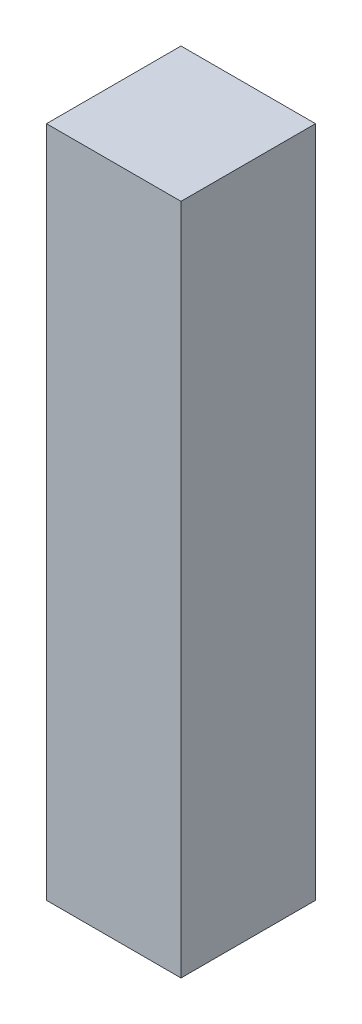
ISO-10303-21;
HEADER;
FILE_DESCRIPTION(('STEP AP214'),'2;1');
FILE_NAME('part.step','',(''),(''),'','','');
FILE_SCHEMA(('AUTOMOTIVE_DESIGN { 1 0 10303 214 1 1 1 1 }'));
ENDSEC;
DATA;
#1=APPLICATION_CONTEXT('core data for automotive mechanical design processes');
#2=APPLICATION_PROTOCOL_DEFINITION('international standard','automotive_design',2000,#1);
#3=PRODUCT_CONTEXT('',#1,'mechanical');
#4=PRODUCT('Part','Part','',(#3));
#5=PRODUCT_RELATED_PRODUCT_CATEGORY('part','',(#4));
#6=PRODUCT_DEFINITION_FORMATION('','',#4);
#7=PRODUCT_DEFINITION_CONTEXT('part definition',#1,'design');
#8=PRODUCT_DEFINITION('design','',#6,#7);
#9=PRODUCT_DEFINITION_SHAPE('','',#8);
#10=(LENGTH_UNIT() NAMED_UNIT(*) SI_UNIT(.MILLI.,.METRE.));
#11=(NAMED_UNIT(*) PLANE_ANGLE_UNIT() SI_UNIT($,.RADIAN.));
#12=(NAMED_UNIT(*) SI_UNIT($,.STERADIAN.) SOLID_ANGLE_UNIT());
#13=UNCERTAINTY_MEASURE_WITH_UNIT(LENGTH_MEASURE(1.E-05),#10,'distance_accuracy_value','');
#14=(GEOMETRIC_REPRESENTATION_CONTEXT(3) GLOBAL_UNCERTAINTY_ASSIGNED_CONTEXT((#13)) GLOBAL_UNIT_ASSIGNED_CONTEXT((#10,
#11,#12)) REPRESENTATION_CONTEXT('',''));
#15=CARTESIAN_POINT('',(0.,0.,0.));
#16=DIRECTION('',(0.,0.,1.));
#17=DIRECTION('',(1.,0.,0.));
#18=AXIS2_PLACEMENT_3D('',#15,#16,#17);
#19=CARTESIAN_POINT('',(-4.,40.,-4.));
#20=DIRECTION('',(1.,0.,0.));
#21=DIRECTION('',(0.,0.,-1.));
#22=AXIS2_PLACEMENT_3D('',#19,#20,#21);
#23=PLANE('',#22);
#24=DIRECTION('',(0.,0.,1.));
#25=VECTOR('',#24,1.);
#26=CARTESIAN_POINT('',(-4.,0.,-4.));
#27=LINE('',#26,#25);
#28=CARTESIAN_POINT('',(-4.,0.,-4.));
#29=VERTEX_POINT('',#28);
#30=CARTESIAN_POINT('',(-4.,0.,4.));
#31=VERTEX_POINT('',#30);
#32=EDGE_CURVE('E96',#29,#31,#27,.T.);
#33=ORIENTED_EDGE('',*,*,#32,.T.);
#34=DIRECTION('',(0.,-1.,0.));
#35=VECTOR('',#34,1.);
#36=CARTESIAN_POINT('',(-4.,40.,4.));
#37=LINE('',#36,#35);
#38=CARTESIAN_POINT('',(-4.,40.,4.));
#39=VERTEX_POINT('',#38);
#40=EDGE_CURVE('E11',#39,#31,#37,.T.);
#41=ORIENTED_EDGE('',*,*,#40,.F.);
#42=DIRECTION('',(0.,0.,1.));
#43=VECTOR('',#42,1.);
#44=CARTESIAN_POINT('',(-4.,40.,-4.));
#45=LINE('',#44,#43);
#46=CARTESIAN_POINT('',(-4.,40.,-4.));
#47=VERTEX_POINT('',#46);
#48=EDGE_CURVE('E84',#47,#39,#45,.T.);
#49=ORIENTED_EDGE('',*,*,#48,.F.);
#50=DIRECTION('',(0.,-1.,0.));
#51=VECTOR('',#50,1.);
#52=CARTESIAN_POINT('',(-4.,40.,-4.));
#53=LINE('',#52,#51);
#54=EDGE_CURVE('E92',#47,#29,#53,.T.);
#55=ORIENTED_EDGE('',*,*,#54,.T.);
#56=EDGE_LOOP('',(#33,#41,#49,#55));
#57=FACE_BOUND('',#56,.T.);
#58=ADVANCED_FACE('F33',(#57),#23,.F.);
#59=CARTESIAN_POINT('',(-4.,40.,4.));
#60=DIRECTION('',(0.,0.,-1.));
#61=DIRECTION('',(-1.,0.,0.));
#62=AXIS2_PLACEMENT_3D('',#59,#60,#61);
#63=PLANE('',#62);
#64=DIRECTION('',(1.,0.,0.));
#65=VECTOR('',#64,1.);
#66=CARTESIAN_POINT('',(-4.,0.,4.));
#67=LINE('',#66,#65);
#68=CARTESIAN_POINT('',(4.,0.,4.));
#69=VERTEX_POINT('',#68);
#70=EDGE_CURVE('E88',#31,#69,#67,.T.);
#71=ORIENTED_EDGE('',*,*,#70,.T.);
#72=DIRECTION('',(0.,-1.,0.));
#73=VECTOR('',#72,1.);
#74=CARTESIAN_POINT('',(4.,40.,4.));
#75=LINE('',#74,#73);
#76=CARTESIAN_POINT('',(4.,40.,4.));
#77=VERTEX_POINT('',#76);
#78=EDGE_CURVE('E41',#77,#69,#75,.T.);
#79=ORIENTED_EDGE('',*,*,#78,.F.);
#80=DIRECTION('',(1.,0.,0.));
#81=VECTOR('',#80,1.);
#82=CARTESIAN_POINT('',(-4.,40.,4.));
#83=LINE('',#82,#81);
#84=EDGE_CURVE('E79',#39,#77,#83,.T.);
#85=ORIENTED_EDGE('',*,*,#84,.F.);
#86=ORIENTED_EDGE('',*,*,#40,.T.);
#87=EDGE_LOOP('',(#71,#79,#85,#86));
#88=FACE_BOUND('',#87,.T.);
#89=ADVANCED_FACE('F87',(#88),#63,.F.);
#90=CARTESIAN_POINT('',(4.,40.,-4.));
#91=DIRECTION('',(-1.,0.,0.));
#92=DIRECTION('',(0.,0.,1.));
#93=AXIS2_PLACEMENT_3D('',#90,#91,#92);
#94=PLANE('',#93);
#95=DIRECTION('',(0.,0.,-1.));
#96=VECTOR('',#95,1.);
#97=CARTESIAN_POINT('',(4.,0.,-4.));
#98=LINE('',#97,#96);
#99=CARTESIAN_POINT('',(4.,0.,-4.));
#100=VERTEX_POINT('',#99);
#101=EDGE_CURVE('E66',#69,#100,#98,.T.);
#102=ORIENTED_EDGE('',*,*,#101,.T.);
#103=DIRECTION('',(0.,-1.,0.));
#104=VECTOR('',#103,1.);
#105=CARTESIAN_POINT('',(4.,40.,-4.));
#106=LINE('',#105,#104);
#107=CARTESIAN_POINT('',(4.,40.,-4.));
#108=VERTEX_POINT('',#107);
#109=EDGE_CURVE('E89',#108,#100,#106,.T.);
#110=ORIENTED_EDGE('',*,*,#109,.F.);
#111=DIRECTION('',(0.,0.,-1.));
#112=VECTOR('',#111,1.);
#113=CARTESIAN_POINT('',(4.,40.,-4.));
#114=LINE('',#113,#112);
#115=EDGE_CURVE('E82',#77,#108,#114,.T.);
#116=ORIENTED_EDGE('',*,*,#115,.F.);
#117=ORIENTED_EDGE('',*,*,#78,.T.);
#118=EDGE_LOOP('',(#102,#110,#116,#117));
#119=FACE_BOUND('',#118,.T.);
#120=ADVANCED_FACE('F90',(#119),#94,.F.);
#121=CARTESIAN_POINT('',(-4.,40.,-4.));
#122=DIRECTION('',(0.,0.,1.));
#123=DIRECTION('',(1.,0.,0.));
#124=AXIS2_PLACEMENT_3D('',#121,#122,#123);
#125=PLANE('',#124);
#126=DIRECTION('',(-1.,0.,0.));
#127=VECTOR('',#126,1.);
#128=CARTESIAN_POINT('',(-4.,0.,-4.));
#129=LINE('',#128,#127);
#130=EDGE_CURVE('E72',#100,#29,#129,.T.);
#131=ORIENTED_EDGE('',*,*,#130,.T.);
#132=ORIENTED_EDGE('',*,*,#54,.F.);
#133=DIRECTION('',(-1.,0.,0.));
#134=VECTOR('',#133,1.);
#135=CARTESIAN_POINT('',(-4.,40.,-4.));
#136=LINE('',#135,#134);
#137=EDGE_CURVE('E49',#108,#47,#136,.T.);
#138=ORIENTED_EDGE('',*,*,#137,.F.);
#139=ORIENTED_EDGE('',*,*,#109,.T.);
#140=EDGE_LOOP('',(#131,#132,#138,#139));
#141=FACE_BOUND('',#140,.T.);
#142=ADVANCED_FACE('F103',(#141),#125,.F.);
#143=CARTESIAN_POINT('',(0.,40.,0.));
#144=DIRECTION('',(0.,1.,0.));
#145=DIRECTION('',(0.,0.,1.));
#146=AXIS2_PLACEMENT_3D('',#143,#144,#145);
#147=PLANE('',#146);
#148=ORIENTED_EDGE('',*,*,#48,.T.);
#149=ORIENTED_EDGE('',*,*,#84,.T.);
#150=ORIENTED_EDGE('',*,*,#115,.T.);
#151=ORIENTED_EDGE('',*,*,#137,.T.);
#152=EDGE_LOOP('',(#148,#149,#150,#151));
#153=FACE_BOUND('',#152,.T.);
#154=ADVANCED_FACE('F80',(#153),#147,.T.);
#155=CARTESIAN_POINT('',(0.,0.,0.));
#156=DIRECTION('',(0.,1.,0.));
#157=DIRECTION('',(0.,0.,1.));
#158=AXIS2_PLACEMENT_3D('',#155,#156,#157);
#159=PLANE('',#158);
#160=ORIENTED_EDGE('',*,*,#32,.F.);
#161=ORIENTED_EDGE('',*,*,#130,.F.);
#162=ORIENTED_EDGE('',*,*,#101,.F.);
#163=ORIENTED_EDGE('',*,*,#70,.F.);
#164=EDGE_LOOP('',(#160,#161,#162,#163));
#165=FACE_BOUND('',#164,.T.);
#166=ADVANCED_FACE('F106',(#165),#159,.F.);
#167=CLOSED_SHELL('',(#58,#89,#120,#142,#154,#166));
#168=MANIFOLD_SOLID_BREP('B2',#167);
#169=ADVANCED_BREP_SHAPE_REPRESENTATION('',(#18,#168),#14);
#170=SHAPE_DEFINITION_REPRESENTATION(#9,#169);
ENDSEC;
END-ISO-10303-21;
